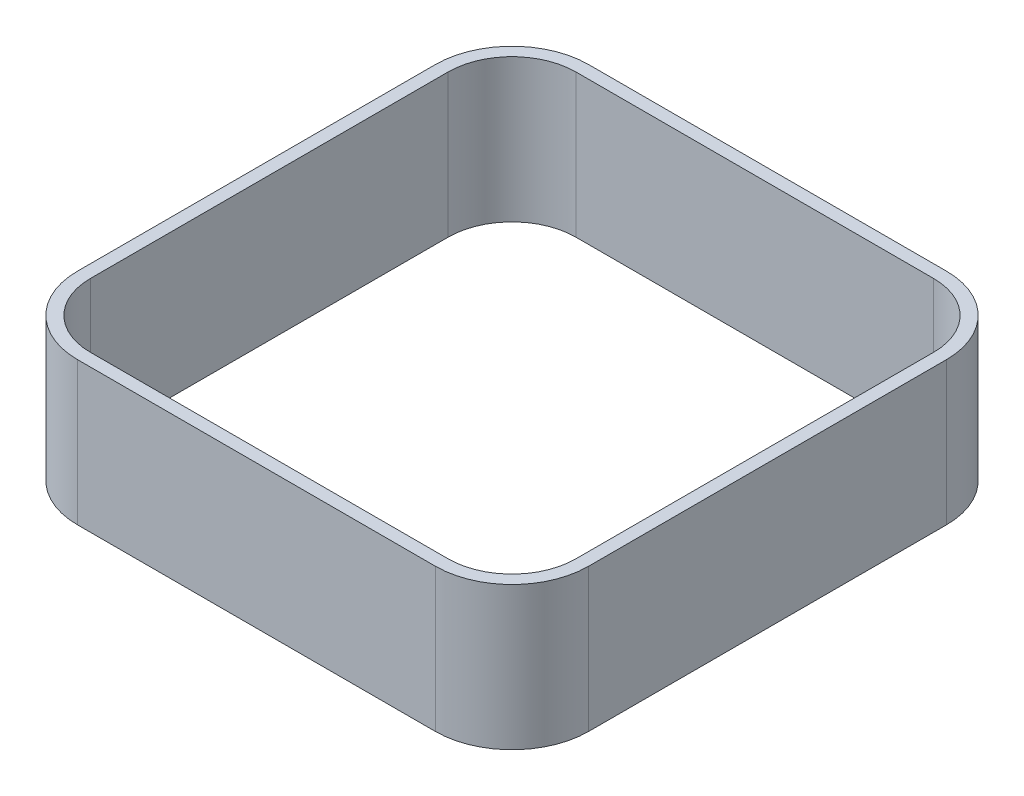
ISO-10303-21;
HEADER;
FILE_DESCRIPTION(('STEP AP214'),'2;1');
FILE_NAME('part.step','',(''),(''),'','','');
FILE_SCHEMA(('AUTOMOTIVE_DESIGN { 1 0 10303 214 1 1 1 1 }'));
ENDSEC;
DATA;
#1=APPLICATION_CONTEXT('core data for automotive mechanical design processes');
#2=APPLICATION_PROTOCOL_DEFINITION('international standard','automotive_design',2000,#1);
#3=PRODUCT_CONTEXT('',#1,'mechanical');
#4=PRODUCT('Part','Part','',(#3));
#5=PRODUCT_RELATED_PRODUCT_CATEGORY('part','',(#4));
#6=PRODUCT_DEFINITION_FORMATION('','',#4);
#7=PRODUCT_DEFINITION_CONTEXT('part definition',#1,'design');
#8=PRODUCT_DEFINITION('design','',#6,#7);
#9=PRODUCT_DEFINITION_SHAPE('','',#8);
#10=(LENGTH_UNIT() NAMED_UNIT(*) SI_UNIT(.MILLI.,.METRE.));
#11=(NAMED_UNIT(*) PLANE_ANGLE_UNIT() SI_UNIT($,.RADIAN.));
#12=(NAMED_UNIT(*) SI_UNIT($,.STERADIAN.) SOLID_ANGLE_UNIT());
#13=UNCERTAINTY_MEASURE_WITH_UNIT(LENGTH_MEASURE(1.E-05),#10,'distance_accuracy_value','');
#14=(GEOMETRIC_REPRESENTATION_CONTEXT(3) GLOBAL_UNCERTAINTY_ASSIGNED_CONTEXT((#13)) GLOBAL_UNIT_ASSIGNED_CONTEXT((#10,
#11,#12)) REPRESENTATION_CONTEXT('',''));
#15=CARTESIAN_POINT('',(0.,0.,0.));
#16=DIRECTION('',(0.,0.,1.));
#17=DIRECTION('',(1.,0.,0.));
#18=AXIS2_PLACEMENT_3D('',#15,#16,#17);
#19=CARTESIAN_POINT('',(254.,142.24,-254.));
#20=DIRECTION('',(-1.,0.,0.));
#21=DIRECTION('',(0.,0.,1.));
#22=AXIS2_PLACEMENT_3D('',#19,#20,#21);
#23=PLANE('',#22);
#24=DIRECTION('',(0.,0.,-1.));
#25=VECTOR('',#24,1.);
#26=CARTESIAN_POINT('',(254.,0.,-254.));
#27=LINE('',#26,#25);
#28=CARTESIAN_POINT('',(254.,0.,177.8));
#29=VERTEX_POINT('',#28);
#30=CARTESIAN_POINT('',(254.,0.,-177.8));
#31=VERTEX_POINT('',#30);
#32=EDGE_CURVE('E168',#29,#31,#27,.T.);
#33=ORIENTED_EDGE('',*,*,#32,.T.);
#34=DIRECTION('',(0.,-1.,0.));
#35=VECTOR('',#34,1.);
#36=CARTESIAN_POINT('',(254.,142.24,-177.8));
#37=LINE('',#36,#35);
#38=CARTESIAN_POINT('',(254.,142.24,-177.8));
#39=VERTEX_POINT('',#38);
#40=EDGE_CURVE('E11',#31,#39,#37,.F.);
#41=ORIENTED_EDGE('',*,*,#40,.T.);
#42=DIRECTION('',(0.,0.,-1.));
#43=VECTOR('',#42,1.);
#44=CARTESIAN_POINT('',(254.,142.24,-254.));
#45=LINE('',#44,#43);
#46=CARTESIAN_POINT('',(254.,142.24,177.8));
#47=VERTEX_POINT('',#46);
#48=EDGE_CURVE('E230',#47,#39,#45,.T.);
#49=ORIENTED_EDGE('',*,*,#48,.F.);
#50=DIRECTION('',(0.,-1.,0.));
#51=VECTOR('',#50,1.);
#52=CARTESIAN_POINT('',(254.,142.24,177.8));
#53=LINE('',#52,#51);
#54=EDGE_CURVE('E48',#47,#29,#53,.T.);
#55=ORIENTED_EDGE('',*,*,#54,.T.);
#56=EDGE_LOOP('',(#33,#41,#49,#55));
#57=FACE_BOUND('',#56,.T.);
#58=ADVANCED_FACE('F39',(#57),#23,.F.);
#59=CARTESIAN_POINT('',(-254.,142.24,-254.));
#60=DIRECTION('',(0.,0.,1.));
#61=DIRECTION('',(1.,0.,0.));
#62=AXIS2_PLACEMENT_3D('',#59,#60,#61);
#63=PLANE('',#62);
#64=DIRECTION('',(-1.,0.,0.));
#65=VECTOR('',#64,1.);
#66=CARTESIAN_POINT('',(-254.,0.,-254.));
#67=LINE('',#66,#65);
#68=CARTESIAN_POINT('',(177.8,0.,-254.));
#69=VERTEX_POINT('',#68);
#70=CARTESIAN_POINT('',(-177.8,0.,-254.));
#71=VERTEX_POINT('',#70);
#72=EDGE_CURVE('E251',#69,#71,#67,.T.);
#73=ORIENTED_EDGE('',*,*,#72,.T.);
#74=DIRECTION('',(0.,-1.,0.));
#75=VECTOR('',#74,1.);
#76=CARTESIAN_POINT('',(-177.8,142.24,-254.));
#77=LINE('',#76,#75);
#78=CARTESIAN_POINT('',(-177.8,142.24,-254.));
#79=VERTEX_POINT('',#78);
#80=EDGE_CURVE('E303',#71,#79,#77,.F.);
#81=ORIENTED_EDGE('',*,*,#80,.T.);
#82=DIRECTION('',(-1.,0.,0.));
#83=VECTOR('',#82,1.);
#84=CARTESIAN_POINT('',(-254.,142.24,-254.));
#85=LINE('',#84,#83);
#86=CARTESIAN_POINT('',(177.8,142.24,-254.));
#87=VERTEX_POINT('',#86);
#88=EDGE_CURVE('E234',#87,#79,#85,.T.);
#89=ORIENTED_EDGE('',*,*,#88,.F.);
#90=DIRECTION('',(0.,-1.,0.));
#91=VECTOR('',#90,1.);
#92=CARTESIAN_POINT('',(177.8,142.24,-254.));
#93=LINE('',#92,#91);
#94=EDGE_CURVE('E299',#87,#69,#93,.T.);
#95=ORIENTED_EDGE('',*,*,#94,.T.);
#96=EDGE_LOOP('',(#73,#81,#89,#95));
#97=FACE_BOUND('',#96,.T.);
#98=ADVANCED_FACE('F322',(#97),#63,.F.);
#99=CARTESIAN_POINT('',(-254.,142.24,-254.));
#100=DIRECTION('',(1.,0.,0.));
#101=DIRECTION('',(0.,0.,-1.));
#102=AXIS2_PLACEMENT_3D('',#99,#100,#101);
#103=PLANE('',#102);
#104=DIRECTION('',(0.,0.,1.));
#105=VECTOR('',#104,1.);
#106=CARTESIAN_POINT('',(-254.,0.,-254.));
#107=LINE('',#106,#105);
#108=CARTESIAN_POINT('',(-254.,0.,-177.8));
#109=VERTEX_POINT('',#108);
#110=CARTESIAN_POINT('',(-254.,0.,177.8));
#111=VERTEX_POINT('',#110);
#112=EDGE_CURVE('E255',#109,#111,#107,.T.);
#113=ORIENTED_EDGE('',*,*,#112,.T.);
#114=DIRECTION('',(0.,-1.,0.));
#115=VECTOR('',#114,1.);
#116=CARTESIAN_POINT('',(-254.,142.24,177.8));
#117=LINE('',#116,#115);
#118=CARTESIAN_POINT('',(-254.,142.24,177.8));
#119=VERTEX_POINT('',#118);
#120=EDGE_CURVE('E284',#111,#119,#117,.F.);
#121=ORIENTED_EDGE('',*,*,#120,.T.);
#122=DIRECTION('',(0.,0.,1.));
#123=VECTOR('',#122,1.);
#124=CARTESIAN_POINT('',(-254.,142.24,-254.));
#125=LINE('',#124,#123);
#126=CARTESIAN_POINT('',(-254.,142.24,-177.8));
#127=VERTEX_POINT('',#126);
#128=EDGE_CURVE('E239',#127,#119,#125,.T.);
#129=ORIENTED_EDGE('',*,*,#128,.F.);
#130=DIRECTION('',(0.,-1.,0.));
#131=VECTOR('',#130,1.);
#132=CARTESIAN_POINT('',(-254.,142.24,-177.8));
#133=LINE('',#132,#131);
#134=EDGE_CURVE('E280',#127,#109,#133,.T.);
#135=ORIENTED_EDGE('',*,*,#134,.T.);
#136=EDGE_LOOP('',(#113,#121,#129,#135));
#137=FACE_BOUND('',#136,.T.);
#138=ADVANCED_FACE('F333',(#137),#103,.F.);
#139=CARTESIAN_POINT('',(-254.,142.24,254.));
#140=DIRECTION('',(0.,0.,-1.));
#141=DIRECTION('',(-1.,0.,0.));
#142=AXIS2_PLACEMENT_3D('',#139,#140,#141);
#143=PLANE('',#142);
#144=DIRECTION('',(1.,0.,0.));
#145=VECTOR('',#144,1.);
#146=CARTESIAN_POINT('',(-254.,142.24,254.));
#147=LINE('',#146,#145);
#148=CARTESIAN_POINT('',(-177.8,142.24,254.));
#149=VERTEX_POINT('',#148);
#150=CARTESIAN_POINT('',(177.8,142.24,254.));
#151=VERTEX_POINT('',#150);
#152=EDGE_CURVE('E243',#149,#151,#147,.T.);
#153=ORIENTED_EDGE('',*,*,#152,.F.);
#154=DIRECTION('',(0.,-1.,0.));
#155=VECTOR('',#154,1.);
#156=CARTESIAN_POINT('',(-177.8,142.24,254.));
#157=LINE('',#156,#155);
#158=CARTESIAN_POINT('',(-177.8,0.,254.));
#159=VERTEX_POINT('',#158);
#160=EDGE_CURVE('E264',#149,#159,#157,.T.);
#161=ORIENTED_EDGE('',*,*,#160,.T.);
#162=DIRECTION('',(1.,0.,0.));
#163=VECTOR('',#162,1.);
#164=CARTESIAN_POINT('',(-254.,0.,254.));
#165=LINE('',#164,#163);
#166=CARTESIAN_POINT('',(177.8,0.,254.));
#167=VERTEX_POINT('',#166);
#168=EDGE_CURVE('E235',#159,#167,#165,.T.);
#169=ORIENTED_EDGE('',*,*,#168,.T.);
#170=DIRECTION('',(0.,-1.,0.));
#171=VECTOR('',#170,1.);
#172=CARTESIAN_POINT('',(177.8,142.24,254.));
#173=LINE('',#172,#171);
#174=EDGE_CURVE('E247',#167,#151,#173,.F.);
#175=ORIENTED_EDGE('',*,*,#174,.T.);
#176=EDGE_LOOP('',(#153,#161,#169,#175));
#177=FACE_BOUND('',#176,.T.);
#178=ADVANCED_FACE('F341',(#177),#143,.F.);
#179=CARTESIAN_POINT('',(0.,142.24,0.));
#180=DIRECTION('',(0.,1.,0.));
#181=DIRECTION('',(0.,0.,1.));
#182=AXIS2_PLACEMENT_3D('',#179,#180,#181);
#183=PLANE('',#182);
#184=CARTESIAN_POINT('',(-177.8,142.24,-177.8));
#185=DIRECTION('',(0.,1.,0.));
#186=DIRECTION('',(0.,0.,1.));
#187=AXIS2_PLACEMENT_3D('',#184,#185,#186);
#188=CIRCLE('',#187,63.5);
#189=CARTESIAN_POINT('',(-177.8,142.24,-241.3));
#190=VERTEX_POINT('',#189);
#191=CARTESIAN_POINT('',(-241.3,142.24,-177.8));
#192=VERTEX_POINT('',#191);
#193=EDGE_CURVE('E55',#190,#192,#188,.T.);
#194=ORIENTED_EDGE('',*,*,#193,.F.);
#195=DIRECTION('',(-1.,0.,0.));
#196=VECTOR('',#195,1.);
#197=CARTESIAN_POINT('',(177.8,142.24,-241.3));
#198=LINE('',#197,#196);
#199=CARTESIAN_POINT('',(177.8,142.24,-241.3));
#200=VERTEX_POINT('',#199);
#201=EDGE_CURVE('E161',#200,#190,#198,.T.);
#202=ORIENTED_EDGE('',*,*,#201,.F.);
#203=CARTESIAN_POINT('',(177.8,142.24,-177.8));
#204=DIRECTION('',(0.,1.,0.));
#205=DIRECTION('',(0.,0.,1.));
#206=AXIS2_PLACEMENT_3D('',#203,#204,#205);
#207=CIRCLE('',#206,63.5000000000001);
#208=CARTESIAN_POINT('',(241.3,142.24,-177.8));
#209=VERTEX_POINT('',#208);
#210=EDGE_CURVE('E204',#209,#200,#207,.T.);
#211=ORIENTED_EDGE('',*,*,#210,.F.);
#212=DIRECTION('',(0.,0.,-1.));
#213=VECTOR('',#212,1.);
#214=CARTESIAN_POINT('',(241.3,142.24,177.8));
#215=LINE('',#214,#213);
#216=CARTESIAN_POINT('',(241.3,142.24,177.8));
#217=VERTEX_POINT('',#216);
#218=EDGE_CURVE('E200',#217,#209,#215,.T.);
#219=ORIENTED_EDGE('',*,*,#218,.F.);
#220=CARTESIAN_POINT('',(177.8,142.24,177.8));
#221=DIRECTION('',(0.,1.,0.));
#222=DIRECTION('',(0.,0.,1.));
#223=AXIS2_PLACEMENT_3D('',#220,#221,#222);
#224=CIRCLE('',#223,63.5);
#225=CARTESIAN_POINT('',(177.8,142.24,241.3));
#226=VERTEX_POINT('',#225);
#227=EDGE_CURVE('E196',#226,#217,#224,.T.);
#228=ORIENTED_EDGE('',*,*,#227,.F.);
#229=DIRECTION('',(1.,0.,0.));
#230=VECTOR('',#229,1.);
#231=CARTESIAN_POINT('',(-177.8,142.24,241.3));
#232=LINE('',#231,#230);
#233=CARTESIAN_POINT('',(-177.8,142.24,241.3));
#234=VERTEX_POINT('',#233);
#235=EDGE_CURVE('E192',#234,#226,#232,.T.);
#236=ORIENTED_EDGE('',*,*,#235,.F.);
#237=CARTESIAN_POINT('',(-177.8,142.24,177.8));
#238=DIRECTION('',(0.,1.,0.));
#239=DIRECTION('',(0.,0.,1.));
#240=AXIS2_PLACEMENT_3D('',#237,#238,#239);
#241=CIRCLE('',#240,63.5000000000001);
#242=CARTESIAN_POINT('',(-241.3,142.24,177.8));
#243=VERTEX_POINT('',#242);
#244=EDGE_CURVE('E188',#243,#234,#241,.T.);
#245=ORIENTED_EDGE('',*,*,#244,.F.);
#246=DIRECTION('',(0.,0.,1.));
#247=VECTOR('',#246,1.);
#248=CARTESIAN_POINT('',(-241.3,142.24,-177.8));
#249=LINE('',#248,#247);
#250=EDGE_CURVE('E180',#192,#243,#249,.T.);
#251=ORIENTED_EDGE('',*,*,#250,.F.);
#252=EDGE_LOOP('',(#194,#202,#211,#219,#228,#236,#245,#251));
#253=FACE_BOUND('',#252,.T.);
#254=ORIENTED_EDGE('',*,*,#128,.T.);
#255=CARTESIAN_POINT('',(-177.8,142.24,177.8));
#256=DIRECTION('',(0.,1.,0.));
#257=DIRECTION('',(0.,0.,1.));
#258=AXIS2_PLACEMENT_3D('',#255,#256,#257);
#259=CIRCLE('',#258,76.2);
#260=EDGE_CURVE('E296',#119,#149,#259,.T.);
#261=ORIENTED_EDGE('',*,*,#260,.T.);
#262=ORIENTED_EDGE('',*,*,#152,.T.);
#263=CARTESIAN_POINT('',(177.8,142.24,177.8));
#264=DIRECTION('',(0.,1.,0.));
#265=DIRECTION('',(0.,0.,1.));
#266=AXIS2_PLACEMENT_3D('',#263,#264,#265);
#267=CIRCLE('',#266,76.2);
#268=EDGE_CURVE('E287',#151,#47,#267,.T.);
#269=ORIENTED_EDGE('',*,*,#268,.T.);
#270=ORIENTED_EDGE('',*,*,#48,.T.);
#271=CARTESIAN_POINT('',(177.8,142.24,-177.8));
#272=DIRECTION('',(0.,1.,0.));
#273=DIRECTION('',(0.,0.,1.));
#274=AXIS2_PLACEMENT_3D('',#271,#272,#273);
#275=CIRCLE('',#274,76.2);
#276=EDGE_CURVE('E290',#39,#87,#275,.T.);
#277=ORIENTED_EDGE('',*,*,#276,.T.);
#278=ORIENTED_EDGE('',*,*,#88,.T.);
#279=CARTESIAN_POINT('',(-177.8,142.24,-177.8));
#280=DIRECTION('',(0.,1.,0.));
#281=DIRECTION('',(0.,0.,1.));
#282=AXIS2_PLACEMENT_3D('',#279,#280,#281);
#283=CIRCLE('',#282,76.2);
#284=EDGE_CURVE('E293',#79,#127,#283,.T.);
#285=ORIENTED_EDGE('',*,*,#284,.T.);
#286=EDGE_LOOP('',(#254,#261,#262,#269,#270,#277,#278,#285));
#287=FACE_BOUND('',#286,.T.);
#288=ADVANCED_FACE('F326',(#253,#287),#183,.T.);
#289=CARTESIAN_POINT('',(0.,0.,0.));
#290=DIRECTION('',(0.,1.,0.));
#291=DIRECTION('',(0.,0.,1.));
#292=AXIS2_PLACEMENT_3D('',#289,#290,#291);
#293=PLANE('',#292);
#294=DIRECTION('',(1.,0.,0.));
#295=VECTOR('',#294,1.);
#296=CARTESIAN_POINT('',(177.8,0.,-241.3));
#297=LINE('',#296,#295);
#298=CARTESIAN_POINT('',(-177.8,0.,-241.3));
#299=VERTEX_POINT('',#298);
#300=CARTESIAN_POINT('',(177.8,0.,-241.3));
#301=VERTEX_POINT('',#300);
#302=EDGE_CURVE('E175',#299,#301,#297,.T.);
#303=ORIENTED_EDGE('',*,*,#302,.F.);
#304=CARTESIAN_POINT('',(-177.8,0.,-177.8));
#305=DIRECTION('',(0.,1.,0.));
#306=DIRECTION('',(0.,0.,1.));
#307=AXIS2_PLACEMENT_3D('',#304,#305,#306);
#308=CIRCLE('',#307,63.5);
#309=CARTESIAN_POINT('',(-241.3,0.,-177.8));
#310=VERTEX_POINT('',#309);
#311=EDGE_CURVE('E154',#310,#299,#308,.F.);
#312=ORIENTED_EDGE('',*,*,#311,.F.);
#313=DIRECTION('',(0.,0.,-1.));
#314=VECTOR('',#313,1.);
#315=CARTESIAN_POINT('',(-241.3,0.,-177.8));
#316=LINE('',#315,#314);
#317=CARTESIAN_POINT('',(-241.3,0.,177.8));
#318=VERTEX_POINT('',#317);
#319=EDGE_CURVE('E164',#318,#310,#316,.T.);
#320=ORIENTED_EDGE('',*,*,#319,.F.);
#321=CARTESIAN_POINT('',(-177.8,0.,177.8));
#322=DIRECTION('',(0.,1.,0.));
#323=DIRECTION('',(0.,0.,1.));
#324=AXIS2_PLACEMENT_3D('',#321,#322,#323);
#325=CIRCLE('',#324,63.5000000000001);
#326=CARTESIAN_POINT('',(-177.8,0.,241.3));
#327=VERTEX_POINT('',#326);
#328=EDGE_CURVE('E63',#327,#318,#325,.F.);
#329=ORIENTED_EDGE('',*,*,#328,.F.);
#330=DIRECTION('',(-1.,0.,0.));
#331=VECTOR('',#330,1.);
#332=CARTESIAN_POINT('',(-177.8,0.,241.3));
#333=LINE('',#332,#331);
#334=CARTESIAN_POINT('',(177.8,0.,241.3));
#335=VERTEX_POINT('',#334);
#336=EDGE_CURVE('E499',#335,#327,#333,.T.);
#337=ORIENTED_EDGE('',*,*,#336,.F.);
#338=CARTESIAN_POINT('',(177.8,0.,177.8));
#339=DIRECTION('',(0.,1.,0.));
#340=DIRECTION('',(0.,0.,1.));
#341=AXIS2_PLACEMENT_3D('',#338,#339,#340);
#342=CIRCLE('',#341,63.5);
#343=CARTESIAN_POINT('',(241.3,0.,177.8));
#344=VERTEX_POINT('',#343);
#345=EDGE_CURVE('E503',#344,#335,#342,.F.);
#346=ORIENTED_EDGE('',*,*,#345,.F.);
#347=DIRECTION('',(0.,0.,1.));
#348=VECTOR('',#347,1.);
#349=CARTESIAN_POINT('',(241.3,0.,177.8));
#350=LINE('',#349,#348);
#351=CARTESIAN_POINT('',(241.3,0.,-177.8));
#352=VERTEX_POINT('',#351);
#353=EDGE_CURVE('E510',#352,#344,#350,.T.);
#354=ORIENTED_EDGE('',*,*,#353,.F.);
#355=CARTESIAN_POINT('',(177.8,0.,-177.8));
#356=DIRECTION('',(0.,1.,0.));
#357=DIRECTION('',(0.,0.,1.));
#358=AXIS2_PLACEMENT_3D('',#355,#356,#357);
#359=CIRCLE('',#358,63.5000000000001);
#360=EDGE_CURVE('E182',#301,#352,#359,.F.);
#361=ORIENTED_EDGE('',*,*,#360,.F.);
#362=EDGE_LOOP('',(#303,#312,#320,#329,#337,#346,#354,#361));
#363=FACE_BOUND('',#362,.T.);
#364=ORIENTED_EDGE('',*,*,#168,.F.);
#365=CARTESIAN_POINT('',(-177.8,0.,177.8));
#366=DIRECTION('',(0.,1.,0.));
#367=DIRECTION('',(0.,0.,1.));
#368=AXIS2_PLACEMENT_3D('',#365,#366,#367);
#369=CIRCLE('',#368,76.2);
#370=EDGE_CURVE('E277',#159,#111,#369,.F.);
#371=ORIENTED_EDGE('',*,*,#370,.T.);
#372=ORIENTED_EDGE('',*,*,#112,.F.);
#373=CARTESIAN_POINT('',(-177.8,0.,-177.8));
#374=DIRECTION('',(0.,1.,0.));
#375=DIRECTION('',(0.,0.,1.));
#376=AXIS2_PLACEMENT_3D('',#373,#374,#375);
#377=CIRCLE('',#376,76.2);
#378=EDGE_CURVE('E274',#109,#71,#377,.F.);
#379=ORIENTED_EDGE('',*,*,#378,.T.);
#380=ORIENTED_EDGE('',*,*,#72,.F.);
#381=CARTESIAN_POINT('',(177.8,0.,-177.8));
#382=DIRECTION('',(0.,1.,0.));
#383=DIRECTION('',(0.,0.,1.));
#384=AXIS2_PLACEMENT_3D('',#381,#382,#383);
#385=CIRCLE('',#384,76.2);
#386=EDGE_CURVE('E271',#69,#31,#385,.F.);
#387=ORIENTED_EDGE('',*,*,#386,.T.);
#388=ORIENTED_EDGE('',*,*,#32,.F.);
#389=CARTESIAN_POINT('',(177.8,0.,177.8));
#390=DIRECTION('',(0.,1.,0.));
#391=DIRECTION('',(0.,0.,1.));
#392=AXIS2_PLACEMENT_3D('',#389,#390,#391);
#393=CIRCLE('',#392,76.2);
#394=EDGE_CURVE('E268',#29,#167,#393,.F.);
#395=ORIENTED_EDGE('',*,*,#394,.T.);
#396=EDGE_LOOP('',(#364,#371,#372,#379,#380,#387,#388,#395));
#397=FACE_BOUND('',#396,.T.);
#398=ADVANCED_FACE('F171',(#363,#397),#293,.F.);
#399=CARTESIAN_POINT('',(-177.8,142.24,177.8));
#400=DIRECTION('',(0.,-1.,0.));
#401=DIRECTION('',(0.,0.,-1.));
#402=AXIS2_PLACEMENT_3D('',#399,#400,#401);
#403=CYLINDRICAL_SURFACE('',#402,76.2);
#404=ORIENTED_EDGE('',*,*,#260,.F.);
#405=ORIENTED_EDGE('',*,*,#120,.F.);
#406=ORIENTED_EDGE('',*,*,#370,.F.);
#407=ORIENTED_EDGE('',*,*,#160,.F.);
#408=EDGE_LOOP('',(#404,#405,#406,#407));
#409=FACE_BOUND('',#408,.T.);
#410=ADVANCED_FACE('F338',(#409),#403,.T.);
#411=CARTESIAN_POINT('',(-177.8,142.24,-177.8));
#412=DIRECTION('',(0.,-1.,0.));
#413=DIRECTION('',(0.,0.,-1.));
#414=AXIS2_PLACEMENT_3D('',#411,#412,#413);
#415=CYLINDRICAL_SURFACE('',#414,76.2);
#416=ORIENTED_EDGE('',*,*,#284,.F.);
#417=ORIENTED_EDGE('',*,*,#80,.F.);
#418=ORIENTED_EDGE('',*,*,#378,.F.);
#419=ORIENTED_EDGE('',*,*,#134,.F.);
#420=EDGE_LOOP('',(#416,#417,#418,#419));
#421=FACE_BOUND('',#420,.T.);
#422=ADVANCED_FACE('F330',(#421),#415,.T.);
#423=CARTESIAN_POINT('',(177.8,142.24,-177.8));
#424=DIRECTION('',(0.,-1.,0.));
#425=DIRECTION('',(0.,0.,-1.));
#426=AXIS2_PLACEMENT_3D('',#423,#424,#425);
#427=CYLINDRICAL_SURFACE('',#426,76.2);
#428=ORIENTED_EDGE('',*,*,#276,.F.);
#429=ORIENTED_EDGE('',*,*,#40,.F.);
#430=ORIENTED_EDGE('',*,*,#386,.F.);
#431=ORIENTED_EDGE('',*,*,#94,.F.);
#432=EDGE_LOOP('',(#428,#429,#430,#431));
#433=FACE_BOUND('',#432,.T.);
#434=ADVANCED_FACE('F319',(#433),#427,.T.);
#435=CARTESIAN_POINT('',(177.8,142.24,177.8));
#436=DIRECTION('',(0.,-1.,0.));
#437=DIRECTION('',(0.,0.,-1.));
#438=AXIS2_PLACEMENT_3D('',#435,#436,#437);
#439=CYLINDRICAL_SURFACE('',#438,76.2);
#440=ORIENTED_EDGE('',*,*,#268,.F.);
#441=ORIENTED_EDGE('',*,*,#174,.F.);
#442=ORIENTED_EDGE('',*,*,#394,.F.);
#443=ORIENTED_EDGE('',*,*,#54,.F.);
#444=EDGE_LOOP('',(#440,#441,#442,#443));
#445=FACE_BOUND('',#444,.T.);
#446=ADVANCED_FACE('F41',(#445),#439,.T.);
#447=CARTESIAN_POINT('',(-177.8,-0.001000000000001,-177.8));
#448=DIRECTION('',(0.,1.,0.));
#449=DIRECTION('',(0.,0.,1.));
#450=AXIS2_PLACEMENT_3D('',#447,#448,#449);
#451=CYLINDRICAL_SURFACE('',#450,63.5);
#452=ORIENTED_EDGE('',*,*,#311,.T.);
#453=DIRECTION('',(0.,1.,0.));
#454=VECTOR('',#453,1.);
#455=CARTESIAN_POINT('',(-177.8,-0.001000000000001,-241.3));
#456=LINE('',#455,#454);
#457=EDGE_CURVE('E169',#299,#190,#456,.T.);
#458=ORIENTED_EDGE('',*,*,#457,.T.);
#459=ORIENTED_EDGE('',*,*,#193,.T.);
#460=DIRECTION('',(0.,1.,0.));
#461=VECTOR('',#460,1.);
#462=CARTESIAN_POINT('',(-241.3,-0.001000000000001,-177.8));
#463=LINE('',#462,#461);
#464=EDGE_CURVE('E150',#310,#192,#463,.T.);
#465=ORIENTED_EDGE('',*,*,#464,.F.);
#466=EDGE_LOOP('',(#452,#458,#459,#465));
#467=FACE_BOUND('',#466,.T.);
#468=ADVANCED_FACE('F152',(#467),#451,.F.);
#469=CARTESIAN_POINT('',(177.8,-0.001000000000001,-241.3));
#470=DIRECTION('',(0.,0.,-1.));
#471=DIRECTION('',(-1.,0.,0.));
#472=AXIS2_PLACEMENT_3D('',#469,#470,#471);
#473=PLANE('',#472);
#474=ORIENTED_EDGE('',*,*,#302,.T.);
#475=DIRECTION('',(0.,1.,0.));
#476=VECTOR('',#475,1.);
#477=CARTESIAN_POINT('',(177.8,-0.001000000000001,-241.3));
#478=LINE('',#477,#476);
#479=EDGE_CURVE('E213',#301,#200,#478,.T.);
#480=ORIENTED_EDGE('',*,*,#479,.T.);
#481=ORIENTED_EDGE('',*,*,#201,.T.);
#482=ORIENTED_EDGE('',*,*,#457,.F.);
#483=EDGE_LOOP('',(#474,#480,#481,#482));
#484=FACE_BOUND('',#483,.T.);
#485=ADVANCED_FACE('F348',(#484),#473,.F.);
#486=CARTESIAN_POINT('',(177.8,-0.001000000000001,-177.8));
#487=DIRECTION('',(0.,1.,0.));
#488=DIRECTION('',(0.,0.,1.));
#489=AXIS2_PLACEMENT_3D('',#486,#487,#488);
#490=CYLINDRICAL_SURFACE('',#489,63.5000000000001);
#491=ORIENTED_EDGE('',*,*,#360,.T.);
#492=DIRECTION('',(0.,1.,0.));
#493=VECTOR('',#492,1.);
#494=CARTESIAN_POINT('',(241.3,-0.001000000000001,-177.8));
#495=LINE('',#494,#493);
#496=EDGE_CURVE('E216',#352,#209,#495,.T.);
#497=ORIENTED_EDGE('',*,*,#496,.T.);
#498=ORIENTED_EDGE('',*,*,#210,.T.);
#499=ORIENTED_EDGE('',*,*,#479,.F.);
#500=EDGE_LOOP('',(#491,#497,#498,#499));
#501=FACE_BOUND('',#500,.T.);
#502=ADVANCED_FACE('F408',(#501),#490,.F.);
#503=CARTESIAN_POINT('',(241.3,-0.001000000000001,177.8));
#504=DIRECTION('',(1.,0.,0.));
#505=DIRECTION('',(0.,0.,-1.));
#506=AXIS2_PLACEMENT_3D('',#503,#504,#505);
#507=PLANE('',#506);
#508=ORIENTED_EDGE('',*,*,#353,.T.);
#509=DIRECTION('',(0.,1.,0.));
#510=VECTOR('',#509,1.);
#511=CARTESIAN_POINT('',(241.3,-0.001000000000001,177.8));
#512=LINE('',#511,#510);
#513=EDGE_CURVE('E219',#344,#217,#512,.T.);
#514=ORIENTED_EDGE('',*,*,#513,.T.);
#515=ORIENTED_EDGE('',*,*,#218,.T.);
#516=ORIENTED_EDGE('',*,*,#496,.F.);
#517=EDGE_LOOP('',(#508,#514,#515,#516));
#518=FACE_BOUND('',#517,.T.);
#519=ADVANCED_FACE('F418',(#518),#507,.F.);
#520=CARTESIAN_POINT('',(177.8,-0.001000000000001,177.8));
#521=DIRECTION('',(0.,1.,0.));
#522=DIRECTION('',(0.,0.,1.));
#523=AXIS2_PLACEMENT_3D('',#520,#521,#522);
#524=CYLINDRICAL_SURFACE('',#523,63.5);
#525=ORIENTED_EDGE('',*,*,#345,.T.);
#526=DIRECTION('',(0.,1.,0.));
#527=VECTOR('',#526,1.);
#528=CARTESIAN_POINT('',(177.8,-0.001000000000001,241.3));
#529=LINE('',#528,#527);
#530=EDGE_CURVE('E222',#335,#226,#529,.T.);
#531=ORIENTED_EDGE('',*,*,#530,.T.);
#532=ORIENTED_EDGE('',*,*,#227,.T.);
#533=ORIENTED_EDGE('',*,*,#513,.F.);
#534=EDGE_LOOP('',(#525,#531,#532,#533));
#535=FACE_BOUND('',#534,.T.);
#536=ADVANCED_FACE('F428',(#535),#524,.F.);
#537=CARTESIAN_POINT('',(-177.8,-0.001000000000001,241.3));
#538=DIRECTION('',(0.,0.,1.));
#539=DIRECTION('',(1.,0.,0.));
#540=AXIS2_PLACEMENT_3D('',#537,#538,#539);
#541=PLANE('',#540);
#542=ORIENTED_EDGE('',*,*,#336,.T.);
#543=DIRECTION('',(0.,1.,0.));
#544=VECTOR('',#543,1.);
#545=CARTESIAN_POINT('',(-177.8,-0.001000000000001,241.3));
#546=LINE('',#545,#544);
#547=EDGE_CURVE('E225',#327,#234,#546,.T.);
#548=ORIENTED_EDGE('',*,*,#547,.T.);
#549=ORIENTED_EDGE('',*,*,#235,.T.);
#550=ORIENTED_EDGE('',*,*,#530,.F.);
#551=EDGE_LOOP('',(#542,#548,#549,#550));
#552=FACE_BOUND('',#551,.T.);
#553=ADVANCED_FACE('F438',(#552),#541,.F.);
#554=CARTESIAN_POINT('',(-177.8,-0.001000000000001,177.8));
#555=DIRECTION('',(0.,1.,0.));
#556=DIRECTION('',(0.,0.,1.));
#557=AXIS2_PLACEMENT_3D('',#554,#555,#556);
#558=CYLINDRICAL_SURFACE('',#557,63.5000000000001);
#559=ORIENTED_EDGE('',*,*,#328,.T.);
#560=DIRECTION('',(0.,1.,0.));
#561=VECTOR('',#560,1.);
#562=CARTESIAN_POINT('',(-241.3,-0.001000000000001,177.8));
#563=LINE('',#562,#561);
#564=EDGE_CURVE('E160',#318,#243,#563,.T.);
#565=ORIENTED_EDGE('',*,*,#564,.T.);
#566=ORIENTED_EDGE('',*,*,#244,.T.);
#567=ORIENTED_EDGE('',*,*,#547,.F.);
#568=EDGE_LOOP('',(#559,#565,#566,#567));
#569=FACE_BOUND('',#568,.T.);
#570=ADVANCED_FACE('F448',(#569),#558,.F.);
#571=CARTESIAN_POINT('',(-241.3,-0.001000000000001,-177.8));
#572=DIRECTION('',(-1.,0.,0.));
#573=DIRECTION('',(0.,0.,1.));
#574=AXIS2_PLACEMENT_3D('',#571,#572,#573);
#575=PLANE('',#574);
#576=ORIENTED_EDGE('',*,*,#319,.T.);
#577=ORIENTED_EDGE('',*,*,#464,.T.);
#578=ORIENTED_EDGE('',*,*,#250,.T.);
#579=ORIENTED_EDGE('',*,*,#564,.F.);
#580=EDGE_LOOP('',(#576,#577,#578,#579));
#581=FACE_BOUND('',#580,.T.);
#582=ADVANCED_FACE('F165',(#581),#575,.F.);
#583=CLOSED_SHELL('',(#58,#98,#138,#178,#288,#398,#410,#422,#434,#446,#468,#485,#502,#519,#536,
#553,#570,#582));
#584=MANIFOLD_SOLID_BREP('B2',#583);
#585=ADVANCED_BREP_SHAPE_REPRESENTATION('',(#18,#584),#14);
#586=SHAPE_DEFINITION_REPRESENTATION(#9,#585);
ENDSEC;
END-ISO-10303-21;
